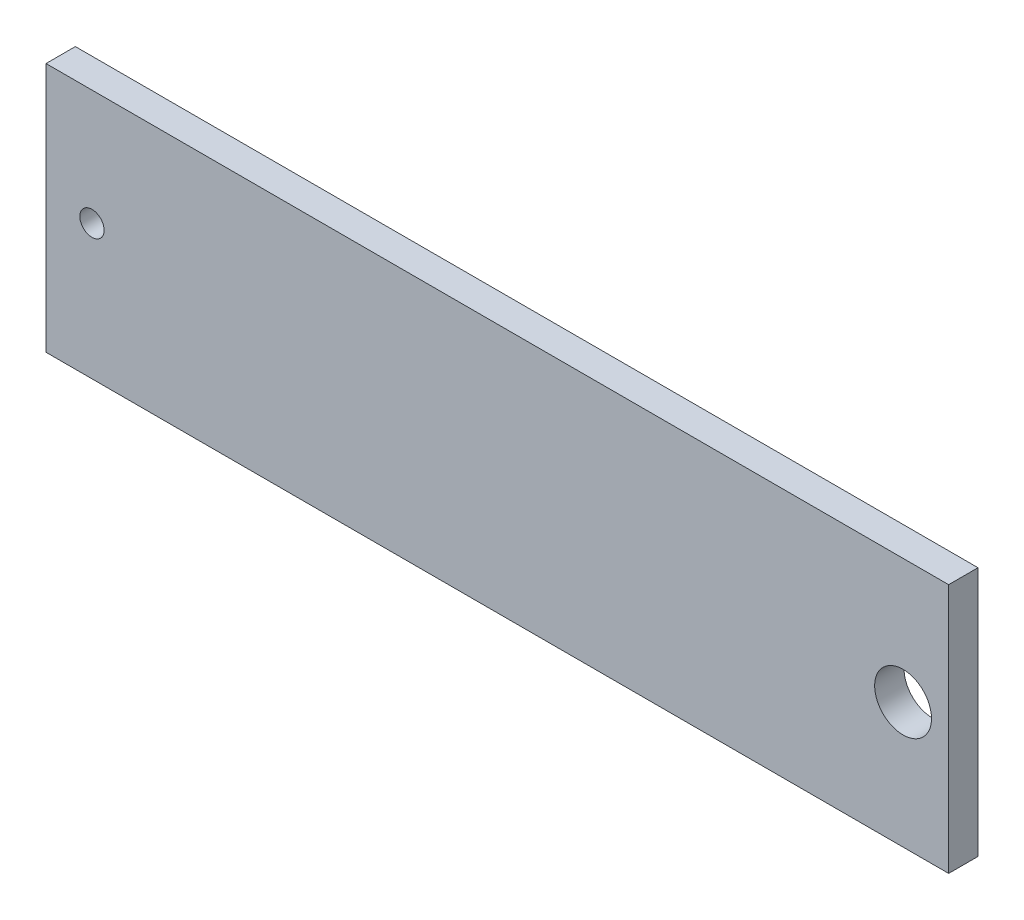
ISO-10303-21;
HEADER;
FILE_DESCRIPTION(('STEP AP214'),'2;1');
FILE_NAME('part.step','',(''),(''),'','','');
FILE_SCHEMA(('AUTOMOTIVE_DESIGN { 1 0 10303 214 1 1 1 1 }'));
ENDSEC;
DATA;
#1=APPLICATION_CONTEXT('core data for automotive mechanical design processes');
#2=APPLICATION_PROTOCOL_DEFINITION('international standard','automotive_design',2000,#1);
#3=PRODUCT_CONTEXT('',#1,'mechanical');
#4=PRODUCT('Part','Part','',(#3));
#5=PRODUCT_RELATED_PRODUCT_CATEGORY('part','',(#4));
#6=PRODUCT_DEFINITION_FORMATION('','',#4);
#7=PRODUCT_DEFINITION_CONTEXT('part definition',#1,'design');
#8=PRODUCT_DEFINITION('design','',#6,#7);
#9=PRODUCT_DEFINITION_SHAPE('','',#8);
#10=(LENGTH_UNIT() NAMED_UNIT(*) SI_UNIT(.MILLI.,.METRE.));
#11=(NAMED_UNIT(*) PLANE_ANGLE_UNIT() SI_UNIT($,.RADIAN.));
#12=(NAMED_UNIT(*) SI_UNIT($,.STERADIAN.) SOLID_ANGLE_UNIT());
#13=UNCERTAINTY_MEASURE_WITH_UNIT(LENGTH_MEASURE(1.E-05),#10,'distance_accuracy_value','');
#14=(GEOMETRIC_REPRESENTATION_CONTEXT(3) GLOBAL_UNCERTAINTY_ASSIGNED_CONTEXT((#13)) GLOBAL_UNIT_ASSIGNED_CONTEXT((#10,
#11,#12)) REPRESENTATION_CONTEXT('',''));
#15=CARTESIAN_POINT('',(0.,0.,0.));
#16=DIRECTION('',(0.,0.,1.));
#17=DIRECTION('',(1.,0.,0.));
#18=AXIS2_PLACEMENT_3D('',#15,#16,#17);
#19=CARTESIAN_POINT('',(-124.341136361379,61.3624833533764,10.));
#20=DIRECTION('',(1.,0.,0.));
#21=DIRECTION('',(0.,0.,-1.));
#22=AXIS2_PLACEMENT_3D('',#19,#20,#21);
#23=PLANE('',#22);
#24=DIRECTION('',(0.,-1.,0.));
#25=VECTOR('',#24,1.);
#26=CARTESIAN_POINT('',(-124.341136361379,61.3624833533764,0.));
#27=LINE('',#26,#25);
#28=CARTESIAN_POINT('',(-124.341136361379,61.3624833533764,0.));
#29=VERTEX_POINT('',#28);
#30=CARTESIAN_POINT('',(-124.341136361379,-23.8242870716831,0.));
#31=VERTEX_POINT('',#30);
#32=EDGE_CURVE('E100',#29,#31,#27,.T.);
#33=ORIENTED_EDGE('',*,*,#32,.T.);
#34=DIRECTION('',(0.,0.,-1.));
#35=VECTOR('',#34,1.);
#36=CARTESIAN_POINT('',(-124.341136361379,-23.8242870716831,10.));
#37=LINE('',#36,#35);
#38=CARTESIAN_POINT('',(-124.341136361379,-23.8242870716831,10.));
#39=VERTEX_POINT('',#38);
#40=EDGE_CURVE('E11',#39,#31,#37,.T.);
#41=ORIENTED_EDGE('',*,*,#40,.F.);
#42=DIRECTION('',(0.,-1.,0.));
#43=VECTOR('',#42,1.);
#44=CARTESIAN_POINT('',(-124.341136361379,61.3624833533764,10.));
#45=LINE('',#44,#43);
#46=CARTESIAN_POINT('',(-124.341136361379,61.3624833533764,10.));
#47=VERTEX_POINT('',#46);
#48=EDGE_CURVE('E88',#47,#39,#45,.T.);
#49=ORIENTED_EDGE('',*,*,#48,.F.);
#50=DIRECTION('',(0.,0.,-1.));
#51=VECTOR('',#50,1.);
#52=CARTESIAN_POINT('',(-124.341136361379,61.3624833533764,10.));
#53=LINE('',#52,#51);
#54=EDGE_CURVE('E96',#47,#29,#53,.T.);
#55=ORIENTED_EDGE('',*,*,#54,.T.);
#56=EDGE_LOOP('',(#33,#41,#49,#55));
#57=FACE_BOUND('',#56,.T.);
#58=ADVANCED_FACE('F37',(#57),#23,.F.);
#59=CARTESIAN_POINT('',(-124.341136361379,-23.8242870716831,10.));
#60=DIRECTION('',(0.,1.,0.));
#61=DIRECTION('',(0.,0.,1.));
#62=AXIS2_PLACEMENT_3D('',#59,#60,#61);
#63=PLANE('',#62);
#64=DIRECTION('',(1.,0.,0.));
#65=VECTOR('',#64,1.);
#66=CARTESIAN_POINT('',(-124.341136361379,-23.8242870716831,0.));
#67=LINE('',#66,#65);
#68=CARTESIAN_POINT('',(183.122904796471,-23.8242870716831,0.));
#69=VERTEX_POINT('',#68);
#70=EDGE_CURVE('E92',#31,#69,#67,.T.);
#71=ORIENTED_EDGE('',*,*,#70,.T.);
#72=DIRECTION('',(0.,0.,-1.));
#73=VECTOR('',#72,1.);
#74=CARTESIAN_POINT('',(183.122904796471,-23.8242870716831,10.));
#75=LINE('',#74,#73);
#76=CARTESIAN_POINT('',(183.122904796471,-23.8242870716831,10.));
#77=VERTEX_POINT('',#76);
#78=EDGE_CURVE('E45',#77,#69,#75,.T.);
#79=ORIENTED_EDGE('',*,*,#78,.F.);
#80=DIRECTION('',(1.,0.,0.));
#81=VECTOR('',#80,1.);
#82=CARTESIAN_POINT('',(-124.341136361379,-23.8242870716831,10.));
#83=LINE('',#82,#81);
#84=EDGE_CURVE('E83',#39,#77,#83,.T.);
#85=ORIENTED_EDGE('',*,*,#84,.F.);
#86=ORIENTED_EDGE('',*,*,#40,.T.);
#87=EDGE_LOOP('',(#71,#79,#85,#86));
#88=FACE_BOUND('',#87,.T.);
#89=ADVANCED_FACE('F91',(#88),#63,.F.);
#90=CARTESIAN_POINT('',(183.122904796471,61.3624833533764,10.));
#91=DIRECTION('',(-1.,0.,0.));
#92=DIRECTION('',(0.,0.,1.));
#93=AXIS2_PLACEMENT_3D('',#90,#91,#92);
#94=PLANE('',#93);
#95=DIRECTION('',(0.,1.,0.));
#96=VECTOR('',#95,1.);
#97=CARTESIAN_POINT('',(183.122904796471,61.3624833533764,0.));
#98=LINE('',#97,#96);
#99=CARTESIAN_POINT('',(183.122904796471,61.3624833533764,0.));
#100=VERTEX_POINT('',#99);
#101=EDGE_CURVE('E70',#69,#100,#98,.T.);
#102=ORIENTED_EDGE('',*,*,#101,.T.);
#103=DIRECTION('',(0.,0.,-1.));
#104=VECTOR('',#103,1.);
#105=CARTESIAN_POINT('',(183.122904796471,61.3624833533764,10.));
#106=LINE('',#105,#104);
#107=CARTESIAN_POINT('',(183.122904796471,61.3624833533764,10.));
#108=VERTEX_POINT('',#107);
#109=EDGE_CURVE('E93',#108,#100,#106,.T.);
#110=ORIENTED_EDGE('',*,*,#109,.F.);
#111=DIRECTION('',(0.,1.,0.));
#112=VECTOR('',#111,1.);
#113=CARTESIAN_POINT('',(183.122904796471,61.3624833533764,10.));
#114=LINE('',#113,#112);
#115=EDGE_CURVE('E86',#77,#108,#114,.T.);
#116=ORIENTED_EDGE('',*,*,#115,.F.);
#117=ORIENTED_EDGE('',*,*,#78,.T.);
#118=EDGE_LOOP('',(#102,#110,#116,#117));
#119=FACE_BOUND('',#118,.T.);
#120=ADVANCED_FACE('F94',(#119),#94,.F.);
#121=CARTESIAN_POINT('',(-124.341136361379,61.3624833533764,10.));
#122=DIRECTION('',(0.,-1.,0.));
#123=DIRECTION('',(0.,0.,-1.));
#124=AXIS2_PLACEMENT_3D('',#121,#122,#123);
#125=PLANE('',#124);
#126=DIRECTION('',(-1.,0.,0.));
#127=VECTOR('',#126,1.);
#128=CARTESIAN_POINT('',(-124.341136361379,61.3624833533764,0.));
#129=LINE('',#128,#127);
#130=EDGE_CURVE('E76',#100,#29,#129,.T.);
#131=ORIENTED_EDGE('',*,*,#130,.T.);
#132=ORIENTED_EDGE('',*,*,#54,.F.);
#133=DIRECTION('',(-1.,0.,0.));
#134=VECTOR('',#133,1.);
#135=CARTESIAN_POINT('',(-124.341136361379,61.3624833533764,10.));
#136=LINE('',#135,#134);
#137=EDGE_CURVE('E53',#108,#47,#136,.T.);
#138=ORIENTED_EDGE('',*,*,#137,.F.);
#139=ORIENTED_EDGE('',*,*,#109,.T.);
#140=EDGE_LOOP('',(#131,#132,#138,#139));
#141=FACE_BOUND('',#140,.T.);
#142=ADVANCED_FACE('F108',(#141),#125,.F.);
#143=CARTESIAN_POINT('',(0.,0.,10.));
#144=DIRECTION('',(0.,0.,1.));
#145=DIRECTION('',(1.,0.,0.));
#146=AXIS2_PLACEMENT_3D('',#143,#144,#145);
#147=PLANE('',#146);
#148=CARTESIAN_POINT('',(-108.689704376683,22.0479620319434,10.));
#149=DIRECTION('',(0.,0.,1.));
#150=DIRECTION('',(1.,0.,0.));
#151=AXIS2_PLACEMENT_3D('',#148,#149,#150);
#152=CIRCLE('',#151,4.13928571669135);
#153=CARTESIAN_POINT('',(-104.550418659992,22.0479620319434,10.));
#154=VERTEX_POINT('',#153);
#155=EDGE_CURVE('E120',#154,#154,#152,.T.);
#156=ORIENTED_EDGE('',*,*,#155,.F.);
#157=EDGE_LOOP('',(#156));
#158=FACE_BOUND('',#157,.T.);
#159=CARTESIAN_POINT('',(167.601690811525,18.9434975549961,10.));
#160=DIRECTION('',(0.,0.,1.));
#161=DIRECTION('',(1.,0.,0.));
#162=AXIS2_PLACEMENT_3D('',#159,#160,#161);
#163=CIRCLE('',#162,9.6821732134564);
#164=CARTESIAN_POINT('',(177.283864024982,18.9434975549961,10.));
#165=VERTEX_POINT('',#164);
#166=EDGE_CURVE('E117',#165,#165,#163,.T.);
#167=ORIENTED_EDGE('',*,*,#166,.F.);
#168=EDGE_LOOP('',(#167));
#169=FACE_BOUND('',#168,.T.);
#170=ORIENTED_EDGE('',*,*,#48,.T.);
#171=ORIENTED_EDGE('',*,*,#84,.T.);
#172=ORIENTED_EDGE('',*,*,#115,.T.);
#173=ORIENTED_EDGE('',*,*,#137,.T.);
#174=EDGE_LOOP('',(#170,#171,#172,#173));
#175=FACE_BOUND('',#174,.T.);
#176=ADVANCED_FACE('F84',(#158,#169,#175),#147,.T.);
#177=CARTESIAN_POINT('',(0.,0.,0.));
#178=DIRECTION('',(0.,0.,1.));
#179=DIRECTION('',(1.,0.,0.));
#180=AXIS2_PLACEMENT_3D('',#177,#178,#179);
#181=PLANE('',#180);
#182=CARTESIAN_POINT('',(-108.689704376683,22.0479620319434,0.));
#183=DIRECTION('',(0.,0.,1.));
#184=DIRECTION('',(1.,0.,0.));
#185=AXIS2_PLACEMENT_3D('',#182,#183,#184);
#186=CIRCLE('',#185,4.13928571669135);
#187=CARTESIAN_POINT('',(-104.550418659992,22.0479620319434,0.));
#188=VERTEX_POINT('',#187);
#189=EDGE_CURVE('E103',#188,#188,#186,.T.);
#190=ORIENTED_EDGE('',*,*,#189,.T.);
#191=EDGE_LOOP('',(#190));
#192=FACE_BOUND('',#191,.T.);
#193=CARTESIAN_POINT('',(167.601690811525,18.9434975549961,0.));
#194=DIRECTION('',(0.,0.,1.));
#195=DIRECTION('',(1.,0.,0.));
#196=AXIS2_PLACEMENT_3D('',#193,#194,#195);
#197=CIRCLE('',#196,9.6821732134564);
#198=CARTESIAN_POINT('',(177.283864024982,18.9434975549961,0.));
#199=VERTEX_POINT('',#198);
#200=EDGE_CURVE('E114',#199,#199,#197,.T.);
#201=ORIENTED_EDGE('',*,*,#200,.T.);
#202=EDGE_LOOP('',(#201));
#203=FACE_BOUND('',#202,.T.);
#204=ORIENTED_EDGE('',*,*,#32,.F.);
#205=ORIENTED_EDGE('',*,*,#130,.F.);
#206=ORIENTED_EDGE('',*,*,#101,.F.);
#207=ORIENTED_EDGE('',*,*,#70,.F.);
#208=EDGE_LOOP('',(#204,#205,#206,#207));
#209=FACE_BOUND('',#208,.T.);
#210=ADVANCED_FACE('F111',(#192,#203,#209),#181,.F.);
#211=CARTESIAN_POINT('',(167.601690811525,18.9434975549961,0.));
#212=DIRECTION('',(0.,0.,1.));
#213=DIRECTION('',(1.,0.,0.));
#214=AXIS2_PLACEMENT_3D('',#211,#212,#213);
#215=CYLINDRICAL_SURFACE('',#214,9.6821732134564);
#216=ORIENTED_EDGE('',*,*,#200,.F.);
#217=EDGE_LOOP('',(#216));
#218=FACE_BOUND('',#217,.T.);
#219=ORIENTED_EDGE('',*,*,#166,.T.);
#220=EDGE_LOOP('',(#219));
#221=FACE_BOUND('',#220,.T.);
#222=ADVANCED_FACE('F131',(#218,#221),#215,.F.);
#223=CARTESIAN_POINT('',(-108.689704376683,22.0479620319434,0.));
#224=DIRECTION('',(0.,0.,1.));
#225=DIRECTION('',(1.,0.,0.));
#226=AXIS2_PLACEMENT_3D('',#223,#224,#225);
#227=CYLINDRICAL_SURFACE('',#226,4.13928571669135);
#228=ORIENTED_EDGE('',*,*,#189,.F.);
#229=EDGE_LOOP('',(#228));
#230=FACE_BOUND('',#229,.T.);
#231=ORIENTED_EDGE('',*,*,#155,.T.);
#232=EDGE_LOOP('',(#231));
#233=FACE_BOUND('',#232,.T.);
#234=ADVANCED_FACE('F128',(#230,#233),#227,.F.);
#235=CLOSED_SHELL('',(#58,#89,#120,#142,#176,#210,#222,#234));
#236=MANIFOLD_SOLID_BREP('B2',#235);
#237=ADVANCED_BREP_SHAPE_REPRESENTATION('',(#18,#236),#14);
#238=SHAPE_DEFINITION_REPRESENTATION(#9,#237);
ENDSEC;
END-ISO-10303-21;
